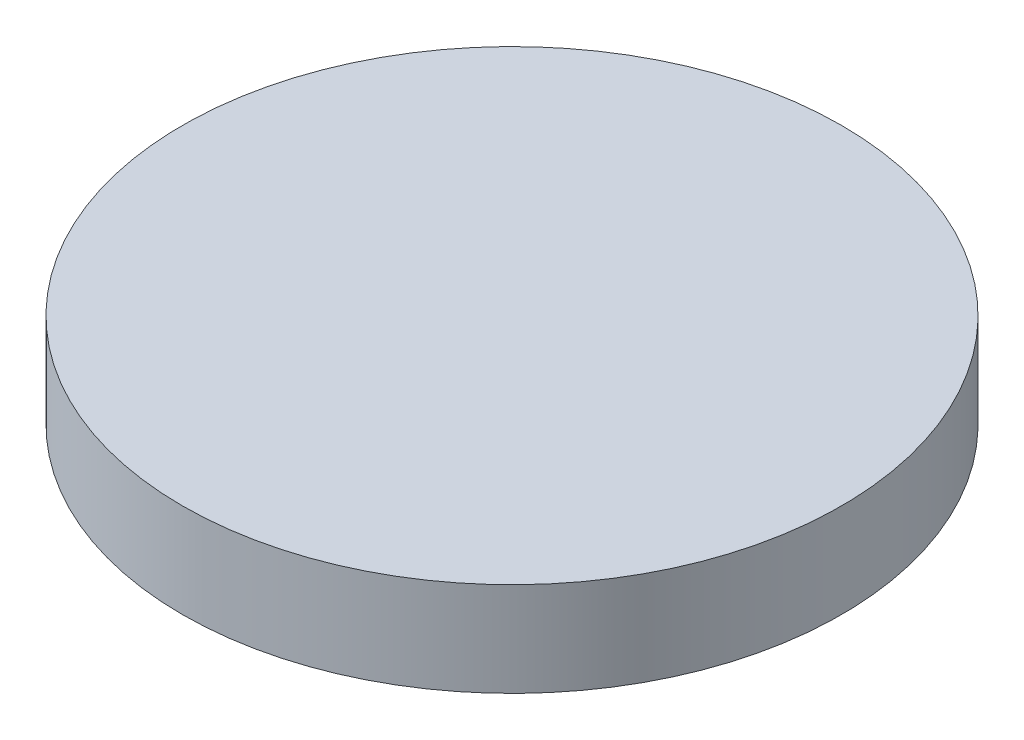
ISO-10303-21;
HEADER;
FILE_DESCRIPTION(('STEP AP214'),'2;1');
FILE_NAME('part.step','',(''),(''),'','','');
FILE_SCHEMA(('AUTOMOTIVE_DESIGN { 1 0 10303 214 1 1 1 1 }'));
ENDSEC;
DATA;
#1=APPLICATION_CONTEXT('core data for automotive mechanical design processes');
#2=APPLICATION_PROTOCOL_DEFINITION('international standard','automotive_design',2000,#1);
#3=PRODUCT_CONTEXT('',#1,'mechanical');
#4=PRODUCT('Part','Part','',(#3));
#5=PRODUCT_RELATED_PRODUCT_CATEGORY('part','',(#4));
#6=PRODUCT_DEFINITION_FORMATION('','',#4);
#7=PRODUCT_DEFINITION_CONTEXT('part definition',#1,'design');
#8=PRODUCT_DEFINITION('design','',#6,#7);
#9=PRODUCT_DEFINITION_SHAPE('','',#8);
#10=(LENGTH_UNIT() NAMED_UNIT(*) SI_UNIT(.MILLI.,.METRE.));
#11=(NAMED_UNIT(*) PLANE_ANGLE_UNIT() SI_UNIT($,.RADIAN.));
#12=(NAMED_UNIT(*) SI_UNIT($,.STERADIAN.) SOLID_ANGLE_UNIT());
#13=UNCERTAINTY_MEASURE_WITH_UNIT(LENGTH_MEASURE(1.E-05),#10,'distance_accuracy_value','');
#14=(GEOMETRIC_REPRESENTATION_CONTEXT(3) GLOBAL_UNCERTAINTY_ASSIGNED_CONTEXT((#13)) GLOBAL_UNIT_ASSIGNED_CONTEXT((#10,
#11,#12)) REPRESENTATION_CONTEXT('',''));
#15=CARTESIAN_POINT('',(0.,0.,0.));
#16=DIRECTION('',(0.,0.,1.));
#17=DIRECTION('',(1.,0.,0.));
#18=AXIS2_PLACEMENT_3D('',#15,#16,#17);
#19=CARTESIAN_POINT('',(0.,1.,0.));
#20=DIRECTION('',(0.,-1.,0.));
#21=DIRECTION('',(0.,0.,-1.));
#22=AXIS2_PLACEMENT_3D('',#19,#20,#21);
#23=CYLINDRICAL_SURFACE('',#22,3.5);
#24=CARTESIAN_POINT('',(0.,1.,0.));
#25=DIRECTION('',(0.,1.,0.));
#26=DIRECTION('',(0.,0.,1.));
#27=AXIS2_PLACEMENT_3D('',#24,#25,#26);
#28=CIRCLE('',#27,3.5);
#29=CARTESIAN_POINT('',(0.,1.,3.5));
#30=VERTEX_POINT('',#29);
#31=EDGE_CURVE('E10',#30,#30,#28,.T.);
#32=ORIENTED_EDGE('',*,*,#31,.F.);
#33=EDGE_LOOP('',(#32));
#34=FACE_BOUND('',#33,.T.);
#35=CARTESIAN_POINT('',(0.,0.,0.));
#36=DIRECTION('',(0.,1.,0.));
#37=DIRECTION('',(0.,0.,1.));
#38=AXIS2_PLACEMENT_3D('',#35,#36,#37);
#39=CIRCLE('',#38,3.5);
#40=CARTESIAN_POINT('',(0.,0.,3.5));
#41=VERTEX_POINT('',#40);
#42=EDGE_CURVE('E34',#41,#41,#39,.T.);
#43=ORIENTED_EDGE('',*,*,#42,.T.);
#44=EDGE_LOOP('',(#43));
#45=FACE_BOUND('',#44,.T.);
#46=ADVANCED_FACE('F31',(#34,#45),#23,.T.);
#47=CARTESIAN_POINT('',(0.,1.,0.));
#48=DIRECTION('',(0.,1.,0.));
#49=DIRECTION('',(0.,0.,1.));
#50=AXIS2_PLACEMENT_3D('',#47,#48,#49);
#51=PLANE('',#50);
#52=ORIENTED_EDGE('',*,*,#31,.T.);
#53=EDGE_LOOP('',(#52));
#54=FACE_BOUND('',#53,.T.);
#55=ADVANCED_FACE('F46',(#54),#51,.T.);
#56=CARTESIAN_POINT('',(0.,0.,0.));
#57=DIRECTION('',(0.,1.,0.));
#58=DIRECTION('',(0.,0.,1.));
#59=AXIS2_PLACEMENT_3D('',#56,#57,#58);
#60=PLANE('',#59);
#61=ORIENTED_EDGE('',*,*,#42,.F.);
#62=EDGE_LOOP('',(#61));
#63=FACE_BOUND('',#62,.T.);
#64=ADVANCED_FACE('F44',(#63),#60,.F.);
#65=CLOSED_SHELL('',(#46,#55,#64));
#66=MANIFOLD_SOLID_BREP('B2',#65);
#67=ADVANCED_BREP_SHAPE_REPRESENTATION('',(#18,#66),#14);
#68=SHAPE_DEFINITION_REPRESENTATION(#9,#67);
ENDSEC;
END-ISO-10303-21;
